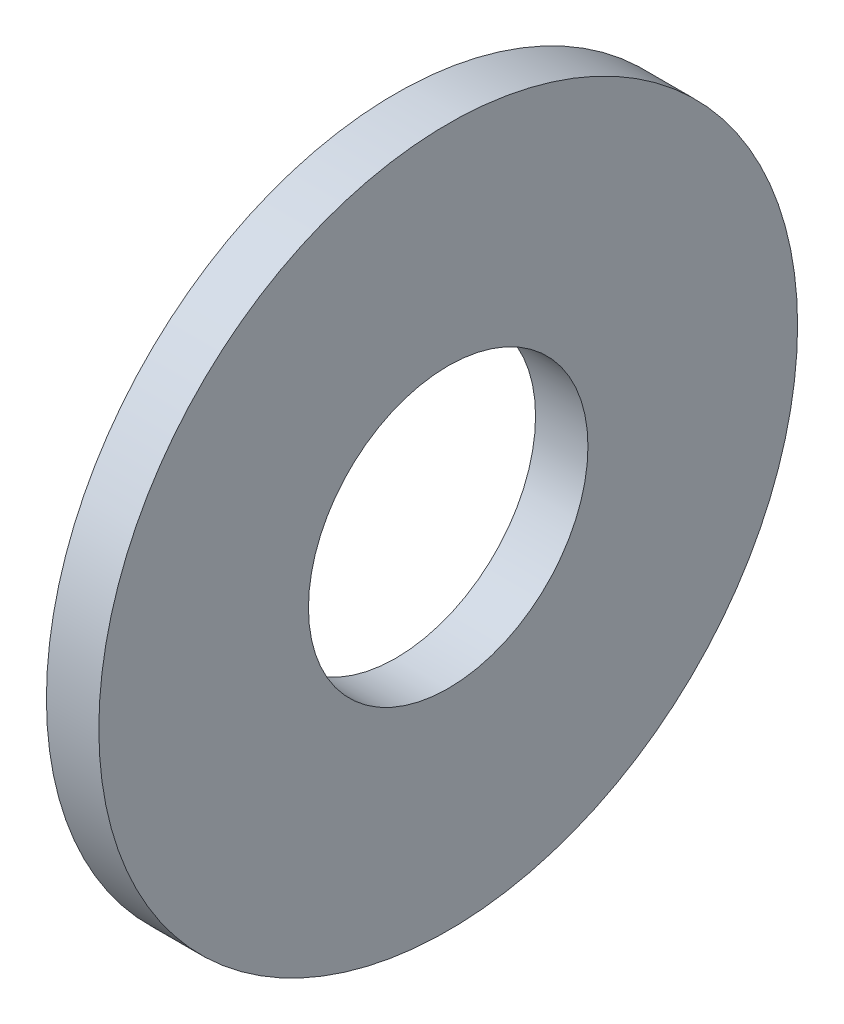
ISO-10303-21;
HEADER;
FILE_DESCRIPTION(('STEP AP214'),'2;1');
FILE_NAME('part.step','',(''),(''),'','','');
FILE_SCHEMA(('AUTOMOTIVE_DESIGN { 1 0 10303 214 1 1 1 1 }'));
ENDSEC;
DATA;
#1=APPLICATION_CONTEXT('core data for automotive mechanical design processes');
#2=APPLICATION_PROTOCOL_DEFINITION('international standard','automotive_design',2000,#1);
#3=PRODUCT_CONTEXT('',#1,'mechanical');
#4=PRODUCT('Part','Part','',(#3));
#5=PRODUCT_RELATED_PRODUCT_CATEGORY('part','',(#4));
#6=PRODUCT_DEFINITION_FORMATION('','',#4);
#7=PRODUCT_DEFINITION_CONTEXT('part definition',#1,'design');
#8=PRODUCT_DEFINITION('design','',#6,#7);
#9=PRODUCT_DEFINITION_SHAPE('','',#8);
#10=(LENGTH_UNIT() NAMED_UNIT(*) SI_UNIT(.MILLI.,.METRE.));
#11=(NAMED_UNIT(*) PLANE_ANGLE_UNIT() SI_UNIT($,.RADIAN.));
#12=(NAMED_UNIT(*) SI_UNIT($,.STERADIAN.) SOLID_ANGLE_UNIT());
#13=UNCERTAINTY_MEASURE_WITH_UNIT(LENGTH_MEASURE(1.E-05),#10,'distance_accuracy_value','');
#14=(GEOMETRIC_REPRESENTATION_CONTEXT(3) GLOBAL_UNCERTAINTY_ASSIGNED_CONTEXT((#13)) GLOBAL_UNIT_ASSIGNED_CONTEXT((#10,
#11,#12)) REPRESENTATION_CONTEXT('',''));
#15=CARTESIAN_POINT('',(0.,0.,0.));
#16=DIRECTION('',(0.,0.,1.));
#17=DIRECTION('',(1.,0.,0.));
#18=AXIS2_PLACEMENT_3D('',#15,#16,#17);
#19=CARTESIAN_POINT('',(0.3,0.,0.));
#20=DIRECTION('',(1.,0.,0.));
#21=DIRECTION('',(0.,0.,-1.));
#22=AXIS2_PLACEMENT_3D('',#19,#20,#21);
#23=PLANE('',#22);
#24=CARTESIAN_POINT('',(0.3,0.,0.));
#25=DIRECTION('',(1.,0.,0.));
#26=DIRECTION('',(0.,0.,-1.));
#27=AXIS2_PLACEMENT_3D('',#24,#25,#26);
#28=CIRCLE('',#27,2.);
#29=CARTESIAN_POINT('',(0.3,0.,-2.));
#30=VERTEX_POINT('',#29);
#31=EDGE_CURVE('E10',#30,#30,#28,.T.);
#32=ORIENTED_EDGE('',*,*,#31,.T.);
#33=EDGE_LOOP('',(#32));
#34=FACE_BOUND('',#33,.T.);
#35=CARTESIAN_POINT('',(0.3,0.,0.));
#36=DIRECTION('',(1.,0.,0.));
#37=DIRECTION('',(0.,0.,-1.));
#38=AXIS2_PLACEMENT_3D('',#35,#36,#37);
#39=CIRCLE('',#38,0.8);
#40=CARTESIAN_POINT('',(0.3,0.,-0.8));
#41=VERTEX_POINT('',#40);
#42=EDGE_CURVE('E49',#41,#41,#39,.T.);
#43=ORIENTED_EDGE('',*,*,#42,.F.);
#44=EDGE_LOOP('',(#43));
#45=FACE_BOUND('',#44,.T.);
#46=ADVANCED_FACE('F38',(#34,#45),#23,.T.);
#47=CARTESIAN_POINT('',(0.,0.,0.));
#48=DIRECTION('',(1.,0.,0.));
#49=DIRECTION('',(0.,0.,-1.));
#50=AXIS2_PLACEMENT_3D('',#47,#48,#49);
#51=PLANE('',#50);
#52=CARTESIAN_POINT('',(0.,0.,0.));
#53=DIRECTION('',(1.,0.,0.));
#54=DIRECTION('',(0.,0.,-1.));
#55=AXIS2_PLACEMENT_3D('',#52,#53,#54);
#56=CIRCLE('',#55,2.);
#57=CARTESIAN_POINT('',(0.,0.,-2.));
#58=VERTEX_POINT('',#57);
#59=EDGE_CURVE('E42',#58,#58,#56,.T.);
#60=ORIENTED_EDGE('',*,*,#59,.F.);
#61=EDGE_LOOP('',(#60));
#62=FACE_BOUND('',#61,.T.);
#63=CARTESIAN_POINT('',(0.,0.,0.));
#64=DIRECTION('',(1.,0.,0.));
#65=DIRECTION('',(0.,0.,-1.));
#66=AXIS2_PLACEMENT_3D('',#63,#64,#65);
#67=CIRCLE('',#66,0.8);
#68=CARTESIAN_POINT('',(0.,0.,-0.8));
#69=VERTEX_POINT('',#68);
#70=EDGE_CURVE('E51',#69,#69,#67,.T.);
#71=ORIENTED_EDGE('',*,*,#70,.T.);
#72=EDGE_LOOP('',(#71));
#73=FACE_BOUND('',#72,.T.);
#74=ADVANCED_FACE('F61',(#62,#73),#51,.F.);
#75=CARTESIAN_POINT('',(0.3,0.,0.));
#76=DIRECTION('',(-1.,0.,0.));
#77=DIRECTION('',(0.,0.,1.));
#78=AXIS2_PLACEMENT_3D('',#75,#76,#77);
#79=CYLINDRICAL_SURFACE('',#78,2.);
#80=ORIENTED_EDGE('',*,*,#31,.F.);
#81=EDGE_LOOP('',(#80));
#82=FACE_BOUND('',#81,.T.);
#83=ORIENTED_EDGE('',*,*,#59,.T.);
#84=EDGE_LOOP('',(#83));
#85=FACE_BOUND('',#84,.T.);
#86=ADVANCED_FACE('F40',(#82,#85),#79,.T.);
#87=CARTESIAN_POINT('',(0.3,0.,0.));
#88=DIRECTION('',(-1.,0.,0.));
#89=DIRECTION('',(0.,0.,1.));
#90=AXIS2_PLACEMENT_3D('',#87,#88,#89);
#91=CYLINDRICAL_SURFACE('',#90,0.8);
#92=ORIENTED_EDGE('',*,*,#42,.T.);
#93=EDGE_LOOP('',(#92));
#94=FACE_BOUND('',#93,.T.);
#95=ORIENTED_EDGE('',*,*,#70,.F.);
#96=EDGE_LOOP('',(#95));
#97=FACE_BOUND('',#96,.T.);
#98=ADVANCED_FACE('F57',(#94,#97),#91,.F.);
#99=CLOSED_SHELL('',(#46,#74,#86,#98));
#100=MANIFOLD_SOLID_BREP('B2',#99);
#101=ADVANCED_BREP_SHAPE_REPRESENTATION('',(#18,#100),#14);
#102=SHAPE_DEFINITION_REPRESENTATION(#9,#101);
ENDSEC;
END-ISO-10303-21;
